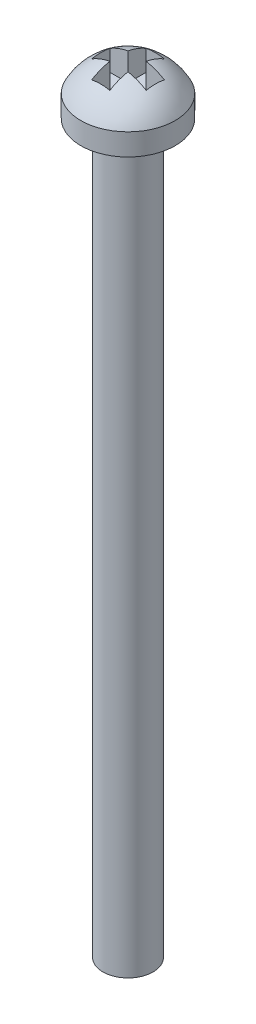
ISO-10303-21;
HEADER;
FILE_DESCRIPTION(('STEP AP214'),'2;1');
FILE_NAME('part.step','',(''),(''),'','','');
FILE_SCHEMA(('AUTOMOTIVE_DESIGN { 1 0 10303 214 1 1 1 1 }'));
ENDSEC;
DATA;
#1=APPLICATION_CONTEXT('core data for automotive mechanical design processes');
#2=APPLICATION_PROTOCOL_DEFINITION('international standard','automotive_design',2000,#1);
#3=PRODUCT_CONTEXT('',#1,'mechanical');
#4=PRODUCT('Part','Part','',(#3));
#5=PRODUCT_RELATED_PRODUCT_CATEGORY('part','',(#4));
#6=PRODUCT_DEFINITION_FORMATION('','',#4);
#7=PRODUCT_DEFINITION_CONTEXT('part definition',#1,'design');
#8=PRODUCT_DEFINITION('design','',#6,#7);
#9=PRODUCT_DEFINITION_SHAPE('','',#8);
#10=(LENGTH_UNIT() NAMED_UNIT(*) SI_UNIT(.MILLI.,.METRE.));
#11=(NAMED_UNIT(*) PLANE_ANGLE_UNIT() SI_UNIT($,.RADIAN.));
#12=(NAMED_UNIT(*) SI_UNIT($,.STERADIAN.) SOLID_ANGLE_UNIT());
#13=UNCERTAINTY_MEASURE_WITH_UNIT(LENGTH_MEASURE(1.E-05),#10,'distance_accuracy_value','');
#14=(GEOMETRIC_REPRESENTATION_CONTEXT(3) GLOBAL_UNCERTAINTY_ASSIGNED_CONTEXT((#13)) GLOBAL_UNIT_ASSIGNED_CONTEXT((#10,
#11,#12)) REPRESENTATION_CONTEXT('',''));
#15=CARTESIAN_POINT('',(0.,0.,0.));
#16=DIRECTION('',(0.,0.,1.));
#17=DIRECTION('',(1.,0.,0.));
#18=AXIS2_PLACEMENT_3D('',#15,#16,#17);
#19=CARTESIAN_POINT('',(0.,-8.93233845147279,0.));
#20=DIRECTION('',(0.,-1.,0.));
#21=DIRECTION('',(0.,0.,-1.));
#22=AXIS2_PLACEMENT_3D('',#19,#20,#21);
#23=CYLINDRICAL_SURFACE('',#22,3.302);
#24=CARTESIAN_POINT('',(0.,52.324,0.));
#25=DIRECTION('',(0.,-1.,0.));
#26=DIRECTION('',(0.,0.,-1.));
#27=AXIS2_PLACEMENT_3D('',#24,#25,#26);
#28=CIRCLE('',#27,3.302);
#29=CARTESIAN_POINT('',(0.,52.324,-3.302));
#30=VERTEX_POINT('',#29);
#31=EDGE_CURVE('E11',#30,#30,#28,.T.);
#32=ORIENTED_EDGE('',*,*,#31,.T.);
#33=EDGE_LOOP('',(#32));
#34=FACE_BOUND('',#33,.T.);
#35=CARTESIAN_POINT('',(0.,50.8,0.));
#36=DIRECTION('',(0.,-1.,0.));
#37=DIRECTION('',(0.,0.,-1.));
#38=AXIS2_PLACEMENT_3D('',#35,#36,#37);
#39=CIRCLE('',#38,3.302);
#40=CARTESIAN_POINT('',(0.,50.8,-3.302));
#41=VERTEX_POINT('',#40);
#42=EDGE_CURVE('E130',#41,#41,#39,.T.);
#43=ORIENTED_EDGE('',*,*,#42,.F.);
#44=EDGE_LOOP('',(#43));
#45=FACE_BOUND('',#44,.T.);
#46=ADVANCED_FACE('F35',(#34,#45),#23,.T.);
#47=CARTESIAN_POINT('',(0.,50.6772346533553,0.));
#48=DIRECTION('',(0.,-1.,0.));
#49=DIRECTION('',(1.,0.,0.));
#50=AXIS2_PLACEMENT_3D('',#47,#48,#49);
#51=SPHERICAL_SURFACE('',#50,3.68985638025519);
#52=CARTESIAN_POINT('',(-1.90499999999999,50.6772346533553,0.));
#53=DIRECTION('',(-1.,0.,0.));
#54=DIRECTION('',(0.,-1.,0.));
#55=AXIS2_PLACEMENT_3D('',#52,#53,#54);
#56=CIRCLE('',#55,3.1600656807905);
#57=CARTESIAN_POINT('',(-1.90499999999999,53.7728428499638,0.635));
#58=VERTEX_POINT('',#57);
#59=CARTESIAN_POINT('',(-1.90499999999999,53.7728428499638,-0.635));
#60=VERTEX_POINT('',#59);
#61=EDGE_CURVE('E133',#58,#60,#56,.T.);
#62=ORIENTED_EDGE('',*,*,#61,.T.);
#63=CARTESIAN_POINT('',(0.,50.6772346533553,-0.635));
#64=DIRECTION('',(0.,0.,-1.));
#65=DIRECTION('',(-1.,0.,0.));
#66=AXIS2_PLACEMENT_3D('',#63,#64,#65);
#67=CIRCLE('',#66,3.63480606180164);
#68=CARTESIAN_POINT('',(-0.634999999999991,54.2561437199439,-0.635));
#69=VERTEX_POINT('',#68);
#70=EDGE_CURVE('E122',#60,#69,#67,.T.);
#71=ORIENTED_EDGE('',*,*,#70,.T.);
#72=CARTESIAN_POINT('',(-0.634999999999991,50.6772346533553,0.));
#73=DIRECTION('',(-1.,0.,0.));
#74=DIRECTION('',(0.,0.,1.));
#75=AXIS2_PLACEMENT_3D('',#72,#73,#74);
#76=CIRCLE('',#75,3.63480606180164);
#77=CARTESIAN_POINT('',(-0.63499999999999,53.7728428499638,-1.90499999999999));
#78=VERTEX_POINT('',#77);
#79=EDGE_CURVE('E409',#69,#78,#76,.T.);
#80=ORIENTED_EDGE('',*,*,#79,.T.);
#81=CARTESIAN_POINT('',(0.,50.6772346533553,-1.90499999999999));
#82=DIRECTION('',(0.,0.,-1.));
#83=DIRECTION('',(-1.,0.,0.));
#84=AXIS2_PLACEMENT_3D('',#81,#82,#83);
#85=CIRCLE('',#84,3.1600656807905);
#86=CARTESIAN_POINT('',(0.635000000000009,53.7728428499638,-1.90499999999999));
#87=VERTEX_POINT('',#86);
#88=EDGE_CURVE('E406',#78,#87,#85,.T.);
#89=ORIENTED_EDGE('',*,*,#88,.T.);
#90=CARTESIAN_POINT('',(0.635000000000009,50.6772346533553,0.));
#91=DIRECTION('',(1.,0.,0.));
#92=DIRECTION('',(0.,0.,-1.));
#93=AXIS2_PLACEMENT_3D('',#90,#91,#92);
#94=CIRCLE('',#93,3.63480606180164);
#95=CARTESIAN_POINT('',(0.63500000000001,54.2561437199438,-0.635));
#96=VERTEX_POINT('',#95);
#97=EDGE_CURVE('E403',#87,#96,#94,.T.);
#98=ORIENTED_EDGE('',*,*,#97,.T.);
#99=CARTESIAN_POINT('',(0.,50.6772346533553,-0.635));
#100=DIRECTION('',(0.,0.,-1.));
#101=DIRECTION('',(-1.,0.,0.));
#102=AXIS2_PLACEMENT_3D('',#99,#100,#101);
#103=CIRCLE('',#102,3.63480606180164);
#104=CARTESIAN_POINT('',(1.90500000000001,53.7728428499638,-0.635));
#105=VERTEX_POINT('',#104);
#106=EDGE_CURVE('E400',#96,#105,#103,.T.);
#107=ORIENTED_EDGE('',*,*,#106,.T.);
#108=CARTESIAN_POINT('',(1.90500000000001,50.6772346533553,0.));
#109=DIRECTION('',(1.,0.,0.));
#110=DIRECTION('',(0.,1.,0.));
#111=AXIS2_PLACEMENT_3D('',#108,#109,#110);
#112=CIRCLE('',#111,3.16006568079049);
#113=CARTESIAN_POINT('',(1.90500000000001,53.7728428499638,0.635));
#114=VERTEX_POINT('',#113);
#115=EDGE_CURVE('E396',#105,#114,#112,.T.);
#116=ORIENTED_EDGE('',*,*,#115,.T.);
#117=CARTESIAN_POINT('',(0.,50.6772346533553,0.635));
#118=DIRECTION('',(0.,0.,1.));
#119=DIRECTION('',(1.,0.,0.));
#120=AXIS2_PLACEMENT_3D('',#117,#118,#119);
#121=CIRCLE('',#120,3.63480606180164);
#122=CARTESIAN_POINT('',(0.63500000000001,54.2561437199438,0.635));
#123=VERTEX_POINT('',#122);
#124=EDGE_CURVE('E393',#114,#123,#121,.T.);
#125=ORIENTED_EDGE('',*,*,#124,.T.);
#126=CARTESIAN_POINT('',(0.63500000000001,50.6772346533553,0.));
#127=DIRECTION('',(1.,0.,0.));
#128=DIRECTION('',(0.,0.,-1.));
#129=AXIS2_PLACEMENT_3D('',#126,#127,#128);
#130=CIRCLE('',#129,3.63480606180164);
#131=CARTESIAN_POINT('',(0.635000000000009,53.7728428499638,1.90500000000001));
#132=VERTEX_POINT('',#131);
#133=EDGE_CURVE('E389',#123,#132,#130,.T.);
#134=ORIENTED_EDGE('',*,*,#133,.T.);
#135=CARTESIAN_POINT('',(0.,50.6772346533553,1.90500000000001));
#136=DIRECTION('',(0.,0.,1.));
#137=DIRECTION('',(1.,0.,0.));
#138=AXIS2_PLACEMENT_3D('',#135,#136,#137);
#139=CIRCLE('',#138,3.1600656807905);
#140=CARTESIAN_POINT('',(-0.634999999999991,53.7728428499638,1.90500000000001));
#141=VERTEX_POINT('',#140);
#142=EDGE_CURVE('E387',#132,#141,#139,.T.);
#143=ORIENTED_EDGE('',*,*,#142,.T.);
#144=CARTESIAN_POINT('',(-0.634999999999992,50.6772346533553,0.));
#145=DIRECTION('',(-1.,0.,0.));
#146=DIRECTION('',(0.,0.,1.));
#147=AXIS2_PLACEMENT_3D('',#144,#145,#146);
#148=CIRCLE('',#147,3.63480606180164);
#149=CARTESIAN_POINT('',(-0.634999999999991,54.2561437199439,0.635));
#150=VERTEX_POINT('',#149);
#151=EDGE_CURVE('E145',#141,#150,#148,.T.);
#152=ORIENTED_EDGE('',*,*,#151,.T.);
#153=CARTESIAN_POINT('',(0.,50.6772346533553,0.635));
#154=DIRECTION('',(0.,0.,1.));
#155=DIRECTION('',(1.,0.,0.));
#156=AXIS2_PLACEMENT_3D('',#153,#154,#155);
#157=CIRCLE('',#156,3.63480606180164);
#158=EDGE_CURVE('E141',#150,#58,#157,.T.);
#159=ORIENTED_EDGE('',*,*,#158,.T.);
#160=EDGE_LOOP('',(#62,#71,#80,#89,#98,#107,#116,#125,#134,#143,#152,#159));
#161=FACE_BOUND('',#160,.T.);
#162=ORIENTED_EDGE('',*,*,#31,.F.);
#163=EDGE_LOOP('',(#162));
#164=FACE_BOUND('',#163,.T.);
#165=ADVANCED_FACE('F138',(#161,#164),#51,.T.);
#166=CARTESIAN_POINT('',(0.,0.,0.));
#167=DIRECTION('',(0.,1.,0.));
#168=DIRECTION('',(0.,0.,1.));
#169=AXIS2_PLACEMENT_3D('',#166,#167,#168);
#170=PLANE('',#169);
#171=CARTESIAN_POINT('',(0.,0.,0.));
#172=DIRECTION('',(0.,-1.,0.));
#173=DIRECTION('',(0.,0.,-1.));
#174=AXIS2_PLACEMENT_3D('',#171,#172,#173);
#175=CIRCLE('',#174,1.75259999999999);
#176=CARTESIAN_POINT('',(0.,0.,-1.75259999999999));
#177=VERTEX_POINT('',#176);
#178=EDGE_CURVE('E42',#177,#177,#175,.T.);
#179=ORIENTED_EDGE('',*,*,#178,.T.);
#180=EDGE_LOOP('',(#179));
#181=FACE_BOUND('',#180,.T.);
#182=ADVANCED_FACE('F206',(#181),#170,.F.);
#183=CARTESIAN_POINT('',(0.,-8.93233845147279,0.));
#184=DIRECTION('',(0.,-1.,0.));
#185=DIRECTION('',(0.,0.,-1.));
#186=AXIS2_PLACEMENT_3D('',#183,#184,#185);
#187=CYLINDRICAL_SURFACE('',#186,1.75259999999999);
#188=ORIENTED_EDGE('',*,*,#178,.F.);
#189=EDGE_LOOP('',(#188));
#190=FACE_BOUND('',#189,.T.);
#191=CARTESIAN_POINT('',(0.,50.8,0.));
#192=DIRECTION('',(0.,-1.,0.));
#193=DIRECTION('',(0.,0.,-1.));
#194=AXIS2_PLACEMENT_3D('',#191,#192,#193);
#195=CIRCLE('',#194,1.75259999999999);
#196=CARTESIAN_POINT('',(0.,50.8,-1.75259999999999));
#197=VERTEX_POINT('',#196);
#198=EDGE_CURVE('E201',#197,#197,#195,.T.);
#199=ORIENTED_EDGE('',*,*,#198,.T.);
#200=EDGE_LOOP('',(#199));
#201=FACE_BOUND('',#200,.T.);
#202=ADVANCED_FACE('F208',(#190,#201),#187,.T.);
#203=CARTESIAN_POINT('',(0.,50.8,0.));
#204=DIRECTION('',(0.,-1.,0.));
#205=DIRECTION('',(0.,0.,-1.));
#206=AXIS2_PLACEMENT_3D('',#203,#204,#205);
#207=PLANE('',#206);
#208=ORIENTED_EDGE('',*,*,#42,.T.);
#209=EDGE_LOOP('',(#208));
#210=FACE_BOUND('',#209,.T.);
#211=ORIENTED_EDGE('',*,*,#198,.F.);
#212=EDGE_LOOP('',(#211));
#213=FACE_BOUND('',#212,.T.);
#214=ADVANCED_FACE('F211',(#210,#213),#207,.T.);
#215=CARTESIAN_POINT('',(-1.90499999999999,54.3680910336105,0.635));
#216=DIRECTION('',(-1.,0.,0.));
#217=DIRECTION('',(0.,-1.,0.));
#218=AXIS2_PLACEMENT_3D('',#215,#216,#217);
#219=PLANE('',#218);
#220=DIRECTION('',(0.,-1.,0.));
#221=VECTOR('',#220,1.);
#222=CARTESIAN_POINT('',(-1.90499999999999,54.3680910336105,0.635));
#223=LINE('',#222,#221);
#224=CARTESIAN_POINT('',(-1.90499999999999,52.324,0.635));
#225=VERTEX_POINT('',#224);
#226=EDGE_CURVE('E57',#58,#225,#223,.T.);
#227=ORIENTED_EDGE('',*,*,#226,.T.);
#228=DIRECTION('',(0.,0.,-1.));
#229=VECTOR('',#228,1.);
#230=CARTESIAN_POINT('',(-1.90499999999999,52.324,0.635));
#231=LINE('',#230,#229);
#232=CARTESIAN_POINT('',(-1.90499999999999,52.324,-0.635));
#233=VERTEX_POINT('',#232);
#234=EDGE_CURVE('E134',#225,#233,#231,.T.);
#235=ORIENTED_EDGE('',*,*,#234,.T.);
#236=DIRECTION('',(0.,-1.,0.));
#237=VECTOR('',#236,1.);
#238=CARTESIAN_POINT('',(-1.90499999999999,54.3680910336105,-0.635));
#239=LINE('',#238,#237);
#240=EDGE_CURVE('E125',#60,#233,#239,.T.);
#241=ORIENTED_EDGE('',*,*,#240,.F.);
#242=ORIENTED_EDGE('',*,*,#61,.F.);
#243=EDGE_LOOP('',(#227,#235,#241,#242));
#244=FACE_BOUND('',#243,.T.);
#245=ADVANCED_FACE('F132',(#244),#219,.F.);
#246=CARTESIAN_POINT('',(-0.634999999999991,54.3680910336105,0.635));
#247=DIRECTION('',(0.,0.,1.));
#248=DIRECTION('',(1.,0.,0.));
#249=AXIS2_PLACEMENT_3D('',#246,#247,#248);
#250=PLANE('',#249);
#251=DIRECTION('',(0.,-1.,0.));
#252=VECTOR('',#251,1.);
#253=CARTESIAN_POINT('',(-0.634999999999991,54.3680910336105,0.635));
#254=LINE('',#253,#252);
#255=CARTESIAN_POINT('',(-0.634999999999991,52.324,0.635));
#256=VERTEX_POINT('',#255);
#257=EDGE_CURVE('E180',#150,#256,#254,.T.);
#258=ORIENTED_EDGE('',*,*,#257,.T.);
#259=DIRECTION('',(-1.,0.,0.));
#260=VECTOR('',#259,1.);
#261=CARTESIAN_POINT('',(-0.634999999999991,52.324,0.635));
#262=LINE('',#261,#260);
#263=EDGE_CURVE('E135',#256,#225,#262,.T.);
#264=ORIENTED_EDGE('',*,*,#263,.T.);
#265=ORIENTED_EDGE('',*,*,#226,.F.);
#266=ORIENTED_EDGE('',*,*,#158,.F.);
#267=EDGE_LOOP('',(#258,#264,#265,#266));
#268=FACE_BOUND('',#267,.T.);
#269=ADVANCED_FACE('F221',(#268),#250,.F.);
#270=CARTESIAN_POINT('',(-0.634999999999991,54.3680910336105,1.90500000000001));
#271=DIRECTION('',(-1.,0.,0.));
#272=DIRECTION('',(0.,0.,1.));
#273=AXIS2_PLACEMENT_3D('',#270,#271,#272);
#274=PLANE('',#273);
#275=DIRECTION('',(0.,-1.,0.));
#276=VECTOR('',#275,1.);
#277=CARTESIAN_POINT('',(-0.634999999999991,54.3680910336105,1.90500000000001));
#278=LINE('',#277,#276);
#279=CARTESIAN_POINT('',(-0.634999999999991,52.324,1.90500000000001));
#280=VERTEX_POINT('',#279);
#281=EDGE_CURVE('E182',#141,#280,#278,.T.);
#282=ORIENTED_EDGE('',*,*,#281,.T.);
#283=DIRECTION('',(0.,0.,-1.));
#284=VECTOR('',#283,1.);
#285=CARTESIAN_POINT('',(-0.634999999999991,52.324,1.90500000000001));
#286=LINE('',#285,#284);
#287=EDGE_CURVE('E174',#280,#256,#286,.T.);
#288=ORIENTED_EDGE('',*,*,#287,.T.);
#289=ORIENTED_EDGE('',*,*,#257,.F.);
#290=ORIENTED_EDGE('',*,*,#151,.F.);
#291=EDGE_LOOP('',(#282,#288,#289,#290));
#292=FACE_BOUND('',#291,.T.);
#293=ADVANCED_FACE('F266',(#292),#274,.F.);
#294=CARTESIAN_POINT('',(0.635000000000009,54.3680910336105,1.90500000000001));
#295=DIRECTION('',(0.,0.,1.));
#296=DIRECTION('',(1.,0.,0.));
#297=AXIS2_PLACEMENT_3D('',#294,#295,#296);
#298=PLANE('',#297);
#299=DIRECTION('',(0.,-1.,0.));
#300=VECTOR('',#299,1.);
#301=CARTESIAN_POINT('',(0.635000000000009,54.3680910336105,1.90500000000001));
#302=LINE('',#301,#300);
#303=CARTESIAN_POINT('',(0.635000000000009,52.324,1.90500000000001));
#304=VERTEX_POINT('',#303);
#305=EDGE_CURVE('E184',#132,#304,#302,.T.);
#306=ORIENTED_EDGE('',*,*,#305,.T.);
#307=DIRECTION('',(-1.,0.,0.));
#308=VECTOR('',#307,1.);
#309=CARTESIAN_POINT('',(0.635000000000009,52.324,1.90500000000001));
#310=LINE('',#309,#308);
#311=EDGE_CURVE('E171',#304,#280,#310,.T.);
#312=ORIENTED_EDGE('',*,*,#311,.T.);
#313=ORIENTED_EDGE('',*,*,#281,.F.);
#314=ORIENTED_EDGE('',*,*,#142,.F.);
#315=EDGE_LOOP('',(#306,#312,#313,#314));
#316=FACE_BOUND('',#315,.T.);
#317=ADVANCED_FACE('F276',(#316),#298,.F.);
#318=CARTESIAN_POINT('',(0.635000000000009,54.3680910336105,1.90500000000001));
#319=DIRECTION('',(1.,0.,0.));
#320=DIRECTION('',(0.,0.,-1.));
#321=AXIS2_PLACEMENT_3D('',#318,#319,#320);
#322=PLANE('',#321);
#323=DIRECTION('',(0.,-1.,0.));
#324=VECTOR('',#323,1.);
#325=CARTESIAN_POINT('',(0.63500000000001,54.3680910336105,0.635));
#326=LINE('',#325,#324);
#327=CARTESIAN_POINT('',(0.635000000000009,52.324,0.635));
#328=VERTEX_POINT('',#327);
#329=EDGE_CURVE('E186',#123,#328,#326,.T.);
#330=ORIENTED_EDGE('',*,*,#329,.T.);
#331=DIRECTION('',(0.,0.,1.));
#332=VECTOR('',#331,1.);
#333=CARTESIAN_POINT('',(0.635000000000009,52.324,1.90500000000001));
#334=LINE('',#333,#332);
#335=EDGE_CURVE('E168',#328,#304,#334,.T.);
#336=ORIENTED_EDGE('',*,*,#335,.T.);
#337=ORIENTED_EDGE('',*,*,#305,.F.);
#338=ORIENTED_EDGE('',*,*,#133,.F.);
#339=EDGE_LOOP('',(#330,#336,#337,#338));
#340=FACE_BOUND('',#339,.T.);
#341=ADVANCED_FACE('F286',(#340),#322,.F.);
#342=CARTESIAN_POINT('',(1.90500000000001,54.3680910336105,0.635));
#343=DIRECTION('',(0.,0.,1.));
#344=DIRECTION('',(1.,0.,0.));
#345=AXIS2_PLACEMENT_3D('',#342,#343,#344);
#346=PLANE('',#345);
#347=DIRECTION('',(0.,-1.,0.));
#348=VECTOR('',#347,1.);
#349=CARTESIAN_POINT('',(1.90500000000001,54.3680910336105,0.635));
#350=LINE('',#349,#348);
#351=CARTESIAN_POINT('',(1.90500000000001,52.324,0.635));
#352=VERTEX_POINT('',#351);
#353=EDGE_CURVE('E188',#114,#352,#350,.T.);
#354=ORIENTED_EDGE('',*,*,#353,.T.);
#355=DIRECTION('',(-1.,0.,0.));
#356=VECTOR('',#355,1.);
#357=CARTESIAN_POINT('',(1.90500000000001,52.324,0.635));
#358=LINE('',#357,#356);
#359=EDGE_CURVE('E165',#352,#328,#358,.T.);
#360=ORIENTED_EDGE('',*,*,#359,.T.);
#361=ORIENTED_EDGE('',*,*,#329,.F.);
#362=ORIENTED_EDGE('',*,*,#124,.F.);
#363=EDGE_LOOP('',(#354,#360,#361,#362));
#364=FACE_BOUND('',#363,.T.);
#365=ADVANCED_FACE('F296',(#364),#346,.F.);
#366=CARTESIAN_POINT('',(1.90500000000001,54.3680910336105,0.635));
#367=DIRECTION('',(1.,0.,0.));
#368=DIRECTION('',(0.,1.,0.));
#369=AXIS2_PLACEMENT_3D('',#366,#367,#368);
#370=PLANE('',#369);
#371=DIRECTION('',(0.,-1.,0.));
#372=VECTOR('',#371,1.);
#373=CARTESIAN_POINT('',(1.90500000000001,54.3680910336105,-0.635));
#374=LINE('',#373,#372);
#375=CARTESIAN_POINT('',(1.90500000000001,52.324,-0.635));
#376=VERTEX_POINT('',#375);
#377=EDGE_CURVE('E190',#105,#376,#374,.T.);
#378=ORIENTED_EDGE('',*,*,#377,.T.);
#379=DIRECTION('',(0.,0.,1.));
#380=VECTOR('',#379,1.);
#381=CARTESIAN_POINT('',(1.90500000000001,52.324,0.635));
#382=LINE('',#381,#380);
#383=EDGE_CURVE('E162',#376,#352,#382,.T.);
#384=ORIENTED_EDGE('',*,*,#383,.T.);
#385=ORIENTED_EDGE('',*,*,#353,.F.);
#386=ORIENTED_EDGE('',*,*,#115,.F.);
#387=EDGE_LOOP('',(#378,#384,#385,#386));
#388=FACE_BOUND('',#387,.T.);
#389=ADVANCED_FACE('F306',(#388),#370,.F.);
#390=CARTESIAN_POINT('',(1.90500000000001,54.3680910336105,-0.635));
#391=DIRECTION('',(0.,0.,-1.));
#392=DIRECTION('',(-1.,0.,0.));
#393=AXIS2_PLACEMENT_3D('',#390,#391,#392);
#394=PLANE('',#393);
#395=DIRECTION('',(0.,-1.,0.));
#396=VECTOR('',#395,1.);
#397=CARTESIAN_POINT('',(0.63500000000001,54.3680910336105,-0.635));
#398=LINE('',#397,#396);
#399=CARTESIAN_POINT('',(0.635000000000009,52.324,-0.635));
#400=VERTEX_POINT('',#399);
#401=EDGE_CURVE('E192',#96,#400,#398,.T.);
#402=ORIENTED_EDGE('',*,*,#401,.T.);
#403=DIRECTION('',(1.,0.,0.));
#404=VECTOR('',#403,1.);
#405=CARTESIAN_POINT('',(1.90500000000001,52.324,-0.635));
#406=LINE('',#405,#404);
#407=EDGE_CURVE('E159',#400,#376,#406,.T.);
#408=ORIENTED_EDGE('',*,*,#407,.T.);
#409=ORIENTED_EDGE('',*,*,#377,.F.);
#410=ORIENTED_EDGE('',*,*,#106,.F.);
#411=EDGE_LOOP('',(#402,#408,#409,#410));
#412=FACE_BOUND('',#411,.T.);
#413=ADVANCED_FACE('F316',(#412),#394,.F.);
#414=CARTESIAN_POINT('',(0.63500000000001,54.3680910336105,-0.635));
#415=DIRECTION('',(1.,0.,0.));
#416=DIRECTION('',(0.,0.,-1.));
#417=AXIS2_PLACEMENT_3D('',#414,#415,#416);
#418=PLANE('',#417);
#419=DIRECTION('',(0.,-1.,0.));
#420=VECTOR('',#419,1.);
#421=CARTESIAN_POINT('',(0.635000000000009,54.3680910336105,-1.90499999999999));
#422=LINE('',#421,#420);
#423=CARTESIAN_POINT('',(0.635000000000009,52.324,-1.90499999999999));
#424=VERTEX_POINT('',#423);
#425=EDGE_CURVE('E194',#87,#424,#422,.T.);
#426=ORIENTED_EDGE('',*,*,#425,.T.);
#427=DIRECTION('',(0.,0.,1.));
#428=VECTOR('',#427,1.);
#429=CARTESIAN_POINT('',(0.635000000000009,52.324,-0.635));
#430=LINE('',#429,#428);
#431=EDGE_CURVE('E156',#424,#400,#430,.T.);
#432=ORIENTED_EDGE('',*,*,#431,.T.);
#433=ORIENTED_EDGE('',*,*,#401,.F.);
#434=ORIENTED_EDGE('',*,*,#97,.F.);
#435=EDGE_LOOP('',(#426,#432,#433,#434));
#436=FACE_BOUND('',#435,.T.);
#437=ADVANCED_FACE('F326',(#436),#418,.F.);
#438=CARTESIAN_POINT('',(0.635000000000009,54.3680910336105,-1.90499999999999));
#439=DIRECTION('',(0.,0.,-1.));
#440=DIRECTION('',(-1.,0.,0.));
#441=AXIS2_PLACEMENT_3D('',#438,#439,#440);
#442=PLANE('',#441);
#443=DIRECTION('',(0.,-1.,0.));
#444=VECTOR('',#443,1.);
#445=CARTESIAN_POINT('',(-0.63499999999999,54.3680910336105,-1.90499999999999));
#446=LINE('',#445,#444);
#447=CARTESIAN_POINT('',(-0.63499999999999,52.324,-1.90499999999999));
#448=VERTEX_POINT('',#447);
#449=EDGE_CURVE('E196',#78,#448,#446,.T.);
#450=ORIENTED_EDGE('',*,*,#449,.T.);
#451=DIRECTION('',(1.,0.,0.));
#452=VECTOR('',#451,1.);
#453=CARTESIAN_POINT('',(0.635000000000009,52.324,-1.90499999999999));
#454=LINE('',#453,#452);
#455=EDGE_CURVE('E153',#448,#424,#454,.T.);
#456=ORIENTED_EDGE('',*,*,#455,.T.);
#457=ORIENTED_EDGE('',*,*,#425,.F.);
#458=ORIENTED_EDGE('',*,*,#88,.F.);
#459=EDGE_LOOP('',(#450,#456,#457,#458));
#460=FACE_BOUND('',#459,.T.);
#461=ADVANCED_FACE('F336',(#460),#442,.F.);
#462=CARTESIAN_POINT('',(-0.634999999999991,54.3680910336105,-0.635));
#463=DIRECTION('',(-1.,0.,0.));
#464=DIRECTION('',(0.,0.,1.));
#465=AXIS2_PLACEMENT_3D('',#462,#463,#464);
#466=PLANE('',#465);
#467=DIRECTION('',(0.,-1.,0.));
#468=VECTOR('',#467,1.);
#469=CARTESIAN_POINT('',(-0.634999999999991,54.3680910336105,-0.635));
#470=LINE('',#469,#468);
#471=CARTESIAN_POINT('',(-0.634999999999991,52.324,-0.635));
#472=VERTEX_POINT('',#471);
#473=EDGE_CURVE('E49',#69,#472,#470,.T.);
#474=ORIENTED_EDGE('',*,*,#473,.T.);
#475=DIRECTION('',(0.,0.,-1.));
#476=VECTOR('',#475,1.);
#477=CARTESIAN_POINT('',(-0.634999999999991,52.324,-0.635));
#478=LINE('',#477,#476);
#479=EDGE_CURVE('E150',#472,#448,#478,.T.);
#480=ORIENTED_EDGE('',*,*,#479,.T.);
#481=ORIENTED_EDGE('',*,*,#449,.F.);
#482=ORIENTED_EDGE('',*,*,#79,.F.);
#483=EDGE_LOOP('',(#474,#480,#481,#482));
#484=FACE_BOUND('',#483,.T.);
#485=ADVANCED_FACE('F346',(#484),#466,.F.);
#486=CARTESIAN_POINT('',(-0.634999999999991,54.3680910336105,-0.635));
#487=DIRECTION('',(0.,0.,-1.));
#488=DIRECTION('',(-1.,0.,0.));
#489=AXIS2_PLACEMENT_3D('',#486,#487,#488);
#490=PLANE('',#489);
#491=ORIENTED_EDGE('',*,*,#240,.T.);
#492=DIRECTION('',(1.,0.,0.));
#493=VECTOR('',#492,1.);
#494=CARTESIAN_POINT('',(-0.634999999999991,52.324,-0.635));
#495=LINE('',#494,#493);
#496=EDGE_CURVE('E143',#233,#472,#495,.T.);
#497=ORIENTED_EDGE('',*,*,#496,.T.);
#498=ORIENTED_EDGE('',*,*,#473,.F.);
#499=ORIENTED_EDGE('',*,*,#70,.F.);
#500=EDGE_LOOP('',(#491,#497,#498,#499));
#501=FACE_BOUND('',#500,.T.);
#502=ADVANCED_FACE('F124',(#501),#490,.F.);
#503=CARTESIAN_POINT('',(0.,52.324,0.));
#504=DIRECTION('',(0.,1.,0.));
#505=DIRECTION('',(0.,0.,1.));
#506=AXIS2_PLACEMENT_3D('',#503,#504,#505);
#507=PLANE('',#506);
#508=ORIENTED_EDGE('',*,*,#234,.F.);
#509=ORIENTED_EDGE('',*,*,#263,.F.);
#510=ORIENTED_EDGE('',*,*,#287,.F.);
#511=ORIENTED_EDGE('',*,*,#311,.F.);
#512=ORIENTED_EDGE('',*,*,#335,.F.);
#513=ORIENTED_EDGE('',*,*,#359,.F.);
#514=ORIENTED_EDGE('',*,*,#383,.F.);
#515=ORIENTED_EDGE('',*,*,#407,.F.);
#516=ORIENTED_EDGE('',*,*,#431,.F.);
#517=ORIENTED_EDGE('',*,*,#455,.F.);
#518=ORIENTED_EDGE('',*,*,#479,.F.);
#519=ORIENTED_EDGE('',*,*,#496,.F.);
#520=EDGE_LOOP('',(#508,#509,#510,#511,#512,#513,#514,#515,#516,#517,#518,#519));
#521=FACE_BOUND('',#520,.T.);
#522=ADVANCED_FACE('F365',(#521),#507,.T.);
#523=CLOSED_SHELL('',(#46,#165,#182,#202,#214,#245,#269,#293,#317,#341,#365,#389,#413,#437,#461,
#485,#502,#522));
#524=MANIFOLD_SOLID_BREP('B2',#523);
#525=ADVANCED_BREP_SHAPE_REPRESENTATION('',(#18,#524),#14);
#526=SHAPE_DEFINITION_REPRESENTATION(#9,#525);
ENDSEC;
END-ISO-10303-21;
